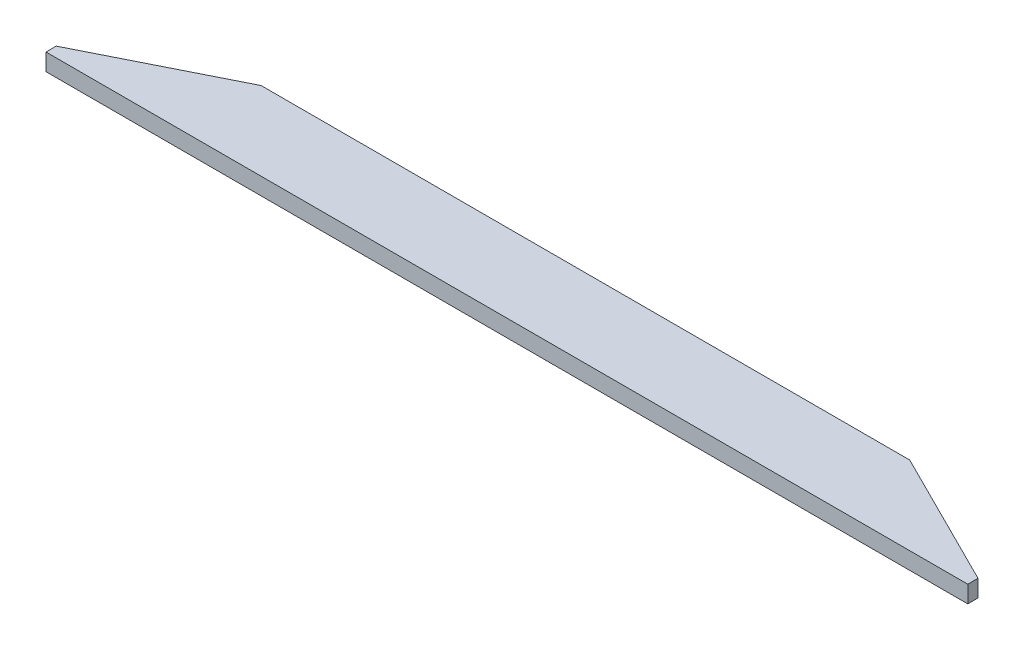
ISO-10303-21;
HEADER;
FILE_DESCRIPTION(('STEP AP214'),'2;1');
FILE_NAME('part.step','',(''),(''),'','','');
FILE_SCHEMA(('AUTOMOTIVE_DESIGN { 1 0 10303 214 1 1 1 1 }'));
ENDSEC;
DATA;
#1=APPLICATION_CONTEXT('core data for automotive mechanical design processes');
#2=APPLICATION_PROTOCOL_DEFINITION('international standard','automotive_design',2000,#1);
#3=PRODUCT_CONTEXT('',#1,'mechanical');
#4=PRODUCT('Part','Part','',(#3));
#5=PRODUCT_RELATED_PRODUCT_CATEGORY('part','',(#4));
#6=PRODUCT_DEFINITION_FORMATION('','',#4);
#7=PRODUCT_DEFINITION_CONTEXT('part definition',#1,'design');
#8=PRODUCT_DEFINITION('design','',#6,#7);
#9=PRODUCT_DEFINITION_SHAPE('','',#8);
#10=(LENGTH_UNIT() NAMED_UNIT(*) SI_UNIT(.MILLI.,.METRE.));
#11=(NAMED_UNIT(*) PLANE_ANGLE_UNIT() SI_UNIT($,.RADIAN.));
#12=(NAMED_UNIT(*) SI_UNIT($,.STERADIAN.) SOLID_ANGLE_UNIT());
#13=UNCERTAINTY_MEASURE_WITH_UNIT(LENGTH_MEASURE(1.E-05),#10,'distance_accuracy_value','');
#14=(GEOMETRIC_REPRESENTATION_CONTEXT(3) GLOBAL_UNCERTAINTY_ASSIGNED_CONTEXT((#13)) GLOBAL_UNIT_ASSIGNED_CONTEXT((#10,
#11,#12)) REPRESENTATION_CONTEXT('',''));
#15=CARTESIAN_POINT('',(0.,0.,0.));
#16=DIRECTION('',(0.,0.,1.));
#17=DIRECTION('',(1.,0.,0.));
#18=AXIS2_PLACEMENT_3D('',#15,#16,#17);
#19=CARTESIAN_POINT('',(135.,5.,-11.5));
#20=DIRECTION('',(-1.,0.,0.));
#21=DIRECTION('',(0.,0.,1.));
#22=AXIS2_PLACEMENT_3D('',#19,#20,#21);
#23=PLANE('',#22);
#24=DIRECTION('',(0.,0.,-1.));
#25=VECTOR('',#24,1.);
#26=CARTESIAN_POINT('',(135.,0.,-11.5));
#27=LINE('',#26,#25);
#28=CARTESIAN_POINT('',(135.,0.,11.5));
#29=VERTEX_POINT('',#28);
#30=CARTESIAN_POINT('',(135.,0.,8.5));
#31=VERTEX_POINT('',#30);
#32=EDGE_CURVE('E110',#29,#31,#27,.T.);
#33=ORIENTED_EDGE('',*,*,#32,.T.);
#34=DIRECTION('',(0.,1.,0.));
#35=VECTOR('',#34,1.);
#36=CARTESIAN_POINT('',(135.,-5.,8.5));
#37=LINE('',#36,#35);
#38=CARTESIAN_POINT('',(135.,5.,8.5));
#39=VERTEX_POINT('',#38);
#40=EDGE_CURVE('E53',#31,#39,#37,.T.);
#41=ORIENTED_EDGE('',*,*,#40,.T.);
#42=DIRECTION('',(0.,0.,-1.));
#43=VECTOR('',#42,1.);
#44=CARTESIAN_POINT('',(135.,5.,-11.5));
#45=LINE('',#44,#43);
#46=CARTESIAN_POINT('',(135.,5.,11.5));
#47=VERTEX_POINT('',#46);
#48=EDGE_CURVE('E106',#47,#39,#45,.T.);
#49=ORIENTED_EDGE('',*,*,#48,.F.);
#50=DIRECTION('',(0.,-1.,0.));
#51=VECTOR('',#50,1.);
#52=CARTESIAN_POINT('',(135.,5.,11.5));
#53=LINE('',#52,#51);
#54=EDGE_CURVE('E104',#47,#29,#53,.T.);
#55=ORIENTED_EDGE('',*,*,#54,.T.);
#56=EDGE_LOOP('',(#33,#41,#49,#55));
#57=FACE_BOUND('',#56,.T.);
#58=ADVANCED_FACE('F32',(#57),#23,.F.);
#59=CARTESIAN_POINT('',(-135.,5.,-11.5));
#60=DIRECTION('',(0.,0.,1.));
#61=DIRECTION('',(1.,0.,0.));
#62=AXIS2_PLACEMENT_3D('',#59,#60,#61);
#63=PLANE('',#62);
#64=DIRECTION('',(-1.,0.,0.));
#65=VECTOR('',#64,1.);
#66=CARTESIAN_POINT('',(-135.,0.,-11.5));
#67=LINE('',#66,#65);
#68=CARTESIAN_POINT('',(95.0000000000001,0.,-11.5));
#69=VERTEX_POINT('',#68);
#70=CARTESIAN_POINT('',(-95.0000000000001,0.,-11.5));
#71=VERTEX_POINT('',#70);
#72=EDGE_CURVE('E113',#69,#71,#67,.T.);
#73=ORIENTED_EDGE('',*,*,#72,.T.);
#74=DIRECTION('',(0.,1.,0.));
#75=VECTOR('',#74,1.);
#76=CARTESIAN_POINT('',(-94.9999999999999,-5.,-11.5));
#77=LINE('',#76,#75);
#78=CARTESIAN_POINT('',(-94.9999999999999,5.,-11.5));
#79=VERTEX_POINT('',#78);
#80=EDGE_CURVE('E46',#71,#79,#77,.T.);
#81=ORIENTED_EDGE('',*,*,#80,.T.);
#82=DIRECTION('',(-1.,0.,0.));
#83=VECTOR('',#82,1.);
#84=CARTESIAN_POINT('',(-135.,5.,-11.5));
#85=LINE('',#84,#83);
#86=CARTESIAN_POINT('',(95.0000000000001,5.,-11.5));
#87=VERTEX_POINT('',#86);
#88=EDGE_CURVE('E96',#87,#79,#85,.T.);
#89=ORIENTED_EDGE('',*,*,#88,.F.);
#90=DIRECTION('',(0.,1.,0.));
#91=VECTOR('',#90,1.);
#92=CARTESIAN_POINT('',(95.0000000000001,-5.,-11.5));
#93=LINE('',#92,#91);
#94=EDGE_CURVE('E114',#69,#87,#93,.T.);
#95=ORIENTED_EDGE('',*,*,#94,.F.);
#96=EDGE_LOOP('',(#73,#81,#89,#95));
#97=FACE_BOUND('',#96,.T.);
#98=ADVANCED_FACE('F136',(#97),#63,.F.);
#99=CARTESIAN_POINT('',(-135.,5.,-11.5));
#100=DIRECTION('',(1.,0.,0.));
#101=DIRECTION('',(0.,0.,-1.));
#102=AXIS2_PLACEMENT_3D('',#99,#100,#101);
#103=PLANE('',#102);
#104=DIRECTION('',(0.,0.,1.));
#105=VECTOR('',#104,1.);
#106=CARTESIAN_POINT('',(-135.,5.,-11.5));
#107=LINE('',#106,#105);
#108=CARTESIAN_POINT('',(-135.,5.,8.5));
#109=VERTEX_POINT('',#108);
#110=CARTESIAN_POINT('',(-135.,5.,11.5));
#111=VERTEX_POINT('',#110);
#112=EDGE_CURVE('E92',#109,#111,#107,.T.);
#113=ORIENTED_EDGE('',*,*,#112,.F.);
#114=DIRECTION('',(0.,1.,0.));
#115=VECTOR('',#114,1.);
#116=CARTESIAN_POINT('',(-135.,-5.,8.5));
#117=LINE('',#116,#115);
#118=CARTESIAN_POINT('',(-135.,0.,8.5));
#119=VERTEX_POINT('',#118);
#120=EDGE_CURVE('E81',#119,#109,#117,.T.);
#121=ORIENTED_EDGE('',*,*,#120,.F.);
#122=DIRECTION('',(0.,0.,1.));
#123=VECTOR('',#122,1.);
#124=CARTESIAN_POINT('',(-135.,0.,-11.5));
#125=LINE('',#124,#123);
#126=CARTESIAN_POINT('',(-135.,0.,11.5));
#127=VERTEX_POINT('',#126);
#128=EDGE_CURVE('E117',#119,#127,#125,.T.);
#129=ORIENTED_EDGE('',*,*,#128,.T.);
#130=DIRECTION('',(0.,-1.,0.));
#131=VECTOR('',#130,1.);
#132=CARTESIAN_POINT('',(-135.,5.,11.5));
#133=LINE('',#132,#131);
#134=EDGE_CURVE('E100',#111,#127,#133,.T.);
#135=ORIENTED_EDGE('',*,*,#134,.F.);
#136=EDGE_LOOP('',(#113,#121,#129,#135));
#137=FACE_BOUND('',#136,.T.);
#138=ADVANCED_FACE('F98',(#137),#103,.F.);
#139=CARTESIAN_POINT('',(-135.,5.,11.5));
#140=DIRECTION('',(0.,0.,-1.));
#141=DIRECTION('',(-1.,0.,0.));
#142=AXIS2_PLACEMENT_3D('',#139,#140,#141);
#143=PLANE('',#142);
#144=DIRECTION('',(1.,0.,0.));
#145=VECTOR('',#144,1.);
#146=CARTESIAN_POINT('',(-135.,0.,11.5));
#147=LINE('',#146,#145);
#148=EDGE_CURVE('E119',#127,#29,#147,.T.);
#149=ORIENTED_EDGE('',*,*,#148,.T.);
#150=ORIENTED_EDGE('',*,*,#54,.F.);
#151=DIRECTION('',(1.,0.,0.));
#152=VECTOR('',#151,1.);
#153=CARTESIAN_POINT('',(-135.,5.,11.5));
#154=LINE('',#153,#152);
#155=EDGE_CURVE('E102',#111,#47,#154,.T.);
#156=ORIENTED_EDGE('',*,*,#155,.F.);
#157=ORIENTED_EDGE('',*,*,#134,.T.);
#158=EDGE_LOOP('',(#149,#150,#156,#157));
#159=FACE_BOUND('',#158,.T.);
#160=ADVANCED_FACE('F134',(#159),#143,.F.);
#161=CARTESIAN_POINT('',(0.,5.,0.));
#162=DIRECTION('',(0.,1.,0.));
#163=DIRECTION('',(0.,0.,1.));
#164=AXIS2_PLACEMENT_3D('',#161,#162,#163);
#165=PLANE('',#164);
#166=DIRECTION('',(0.894427190999916,0.,-0.447213595499958));
#167=VECTOR('',#166,1.);
#168=CARTESIAN_POINT('',(-94.9999999999999,5.,-11.5));
#169=LINE('',#168,#167);
#170=EDGE_CURVE('E84',#109,#79,#169,.T.);
#171=ORIENTED_EDGE('',*,*,#170,.F.);
#172=ORIENTED_EDGE('',*,*,#112,.T.);
#173=ORIENTED_EDGE('',*,*,#155,.T.);
#174=ORIENTED_EDGE('',*,*,#48,.T.);
#175=DIRECTION('',(0.894427190999916,0.,0.447213595499958));
#176=VECTOR('',#175,1.);
#177=CARTESIAN_POINT('',(95.0000000000001,5.,-11.5));
#178=LINE('',#177,#176);
#179=EDGE_CURVE('E138',#87,#39,#178,.T.);
#180=ORIENTED_EDGE('',*,*,#179,.F.);
#181=ORIENTED_EDGE('',*,*,#88,.T.);
#182=EDGE_LOOP('',(#171,#172,#173,#174,#180,#181));
#183=FACE_BOUND('',#182,.T.);
#184=ADVANCED_FACE('F91',(#183),#165,.T.);
#185=CARTESIAN_POINT('',(0.,0.,0.));
#186=DIRECTION('',(0.,1.,0.));
#187=DIRECTION('',(0.,0.,1.));
#188=AXIS2_PLACEMENT_3D('',#185,#186,#187);
#189=PLANE('',#188);
#190=ORIENTED_EDGE('',*,*,#128,.F.);
#191=DIRECTION('',(0.894427190999916,0.,-0.447213595499958));
#192=VECTOR('',#191,1.);
#193=CARTESIAN_POINT('',(-23.6,0.,-47.2));
#194=LINE('',#193,#192);
#195=EDGE_CURVE('E11',#119,#71,#194,.T.);
#196=ORIENTED_EDGE('',*,*,#195,.T.);
#197=ORIENTED_EDGE('',*,*,#72,.F.);
#198=DIRECTION('',(0.894427190999916,0.,0.447213595499958));
#199=VECTOR('',#198,1.);
#200=CARTESIAN_POINT('',(23.6,0.,-47.2));
#201=LINE('',#200,#199);
#202=EDGE_CURVE('E39',#69,#31,#201,.T.);
#203=ORIENTED_EDGE('',*,*,#202,.T.);
#204=ORIENTED_EDGE('',*,*,#32,.F.);
#205=ORIENTED_EDGE('',*,*,#148,.F.);
#206=EDGE_LOOP('',(#190,#196,#197,#203,#204,#205));
#207=FACE_BOUND('',#206,.T.);
#208=ADVANCED_FACE('F126',(#207),#189,.F.);
#209=CARTESIAN_POINT('',(95.0000000000001,-5.,-11.5));
#210=DIRECTION('',(-0.447213595499958,0.,0.894427190999916));
#211=DIRECTION('',(0.894427190999916,0.,0.447213595499958));
#212=AXIS2_PLACEMENT_3D('',#209,#210,#211);
#213=PLANE('',#212);
#214=ORIENTED_EDGE('',*,*,#94,.T.);
#215=ORIENTED_EDGE('',*,*,#179,.T.);
#216=ORIENTED_EDGE('',*,*,#40,.F.);
#217=ORIENTED_EDGE('',*,*,#202,.F.);
#218=EDGE_LOOP('',(#214,#215,#216,#217));
#219=FACE_BOUND('',#218,.T.);
#220=ADVANCED_FACE('F142',(#219),#213,.F.);
#221=CARTESIAN_POINT('',(-94.9999999999999,-5.,-11.5));
#222=DIRECTION('',(0.447213595499958,0.,0.894427190999916));
#223=DIRECTION('',(0.894427190999916,0.,-0.447213595499958));
#224=AXIS2_PLACEMENT_3D('',#221,#222,#223);
#225=PLANE('',#224);
#226=ORIENTED_EDGE('',*,*,#120,.T.);
#227=ORIENTED_EDGE('',*,*,#170,.T.);
#228=ORIENTED_EDGE('',*,*,#80,.F.);
#229=ORIENTED_EDGE('',*,*,#195,.F.);
#230=EDGE_LOOP('',(#226,#227,#228,#229));
#231=FACE_BOUND('',#230,.T.);
#232=ADVANCED_FACE('F83',(#231),#225,.F.);
#233=CLOSED_SHELL('',(#58,#98,#138,#160,#184,#208,#220,#232));
#234=MANIFOLD_SOLID_BREP('B2',#233);
#235=ADVANCED_BREP_SHAPE_REPRESENTATION('',(#18,#234),#14);
#236=SHAPE_DEFINITION_REPRESENTATION(#9,#235);
ENDSEC;
END-ISO-10303-21;
